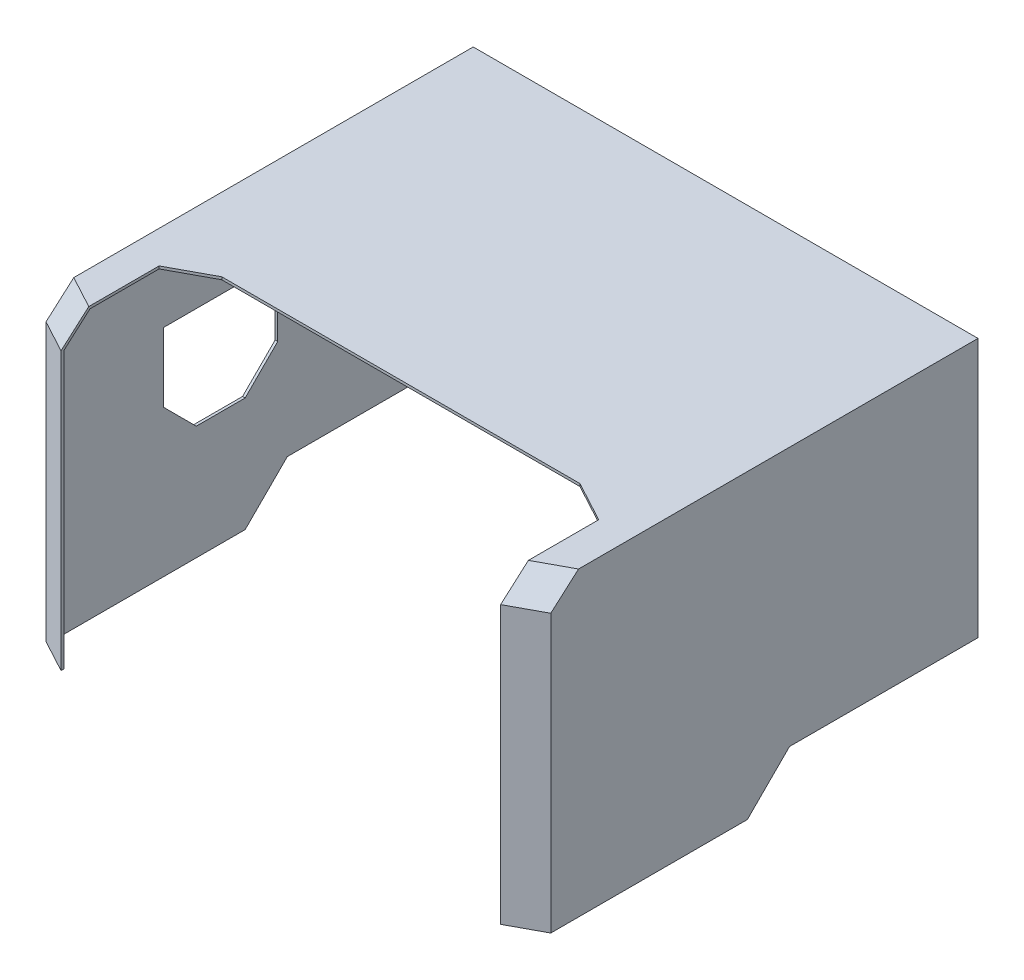
ISO-10303-21;
HEADER;
FILE_DESCRIPTION(('STEP AP214'),'2;1');
FILE_NAME('part.step','',(''),(''),'','','');
FILE_SCHEMA(('AUTOMOTIVE_DESIGN { 1 0 10303 214 1 1 1 1 }'));
ENDSEC;
DATA;
#1=APPLICATION_CONTEXT('core data for automotive mechanical design processes');
#2=APPLICATION_PROTOCOL_DEFINITION('international standard','automotive_design',2000,#1);
#3=PRODUCT_CONTEXT('',#1,'mechanical');
#4=PRODUCT('Part','Part','',(#3));
#5=PRODUCT_RELATED_PRODUCT_CATEGORY('part','',(#4));
#6=PRODUCT_DEFINITION_FORMATION('','',#4);
#7=PRODUCT_DEFINITION_CONTEXT('part definition',#1,'design');
#8=PRODUCT_DEFINITION('design','',#6,#7);
#9=PRODUCT_DEFINITION_SHAPE('','',#8);
#10=(LENGTH_UNIT() NAMED_UNIT(*) SI_UNIT(.MILLI.,.METRE.));
#11=(NAMED_UNIT(*) PLANE_ANGLE_UNIT() SI_UNIT($,.RADIAN.));
#12=(NAMED_UNIT(*) SI_UNIT($,.STERADIAN.) SOLID_ANGLE_UNIT());
#13=UNCERTAINTY_MEASURE_WITH_UNIT(LENGTH_MEASURE(1.E-05),#10,'distance_accuracy_value','');
#14=(GEOMETRIC_REPRESENTATION_CONTEXT(3) GLOBAL_UNCERTAINTY_ASSIGNED_CONTEXT((#13)) GLOBAL_UNIT_ASSIGNED_CONTEXT((#10,
#11,#12)) REPRESENTATION_CONTEXT('',''));
#15=CARTESIAN_POINT('',(0.,0.,0.));
#16=DIRECTION('',(0.,0.,1.));
#17=DIRECTION('',(1.,0.,0.));
#18=AXIS2_PLACEMENT_3D('',#15,#16,#17);
#19=CARTESIAN_POINT('',(354.056220457634,49.99,163.381713280479));
#20=DIRECTION('',(-1.,0.,0.));
#21=DIRECTION('',(0.,0.,1.));
#22=AXIS2_PLACEMENT_3D('',#19,#20,#21);
#23=PLANE('',#22);
#24=DIRECTION('',(0.,-0.660751107356154,0.750605072010319));
#25=VECTOR('',#24,1.);
#26=CARTESIAN_POINT('',(354.056220457634,374.541367845536,301.368842451599));
#27=LINE('',#26,#25);
#28=CARTESIAN_POINT('',(354.056220457634,420.,249.728399504298));
#29=VERTEX_POINT('',#28);
#30=CARTESIAN_POINT('',(354.056220457634,390.,283.808027838802));
#31=VERTEX_POINT('',#30);
#32=EDGE_CURVE('E348',#29,#31,#27,.T.);
#33=ORIENTED_EDGE('',*,*,#32,.F.);
#34=DIRECTION('',(0.,0.,1.));
#35=VECTOR('',#34,1.);
#36=CARTESIAN_POINT('',(354.056220457634,420.,0.));
#37=LINE('',#36,#35);
#38=CARTESIAN_POINT('',(354.056220457634,420.,163.381713280479));
#39=VERTEX_POINT('',#38);
#40=EDGE_CURVE('E352',#39,#29,#37,.T.);
#41=ORIENTED_EDGE('',*,*,#40,.F.);
#42=DIRECTION('',(0.,1.,0.));
#43=VECTOR('',#42,1.);
#44=CARTESIAN_POINT('',(354.056220457634,49.99,163.381713280479));
#45=LINE('',#44,#43);
#46=CARTESIAN_POINT('',(354.056220457634,416.82,163.381713280479));
#47=VERTEX_POINT('',#46);
#48=EDGE_CURVE('E11',#47,#39,#45,.T.);
#49=ORIENTED_EDGE('',*,*,#48,.F.);
#50=DIRECTION('',(0.,0.,1.));
#51=VECTOR('',#50,1.);
#52=CARTESIAN_POINT('',(354.056220457634,416.82,0.));
#53=LINE('',#52,#51);
#54=CARTESIAN_POINT('',(354.056220457634,416.82,248.232077613078));
#55=VERTEX_POINT('',#54);
#56=EDGE_CURVE('E237',#47,#55,#53,.T.);
#57=ORIENTED_EDGE('',*,*,#56,.T.);
#58=DIRECTION('',(0.,-0.660751107356154,0.750605072010319));
#59=VECTOR('',#58,1.);
#60=CARTESIAN_POINT('',(354.056220457634,372.007609995386,299.138397484348));
#61=LINE('',#60,#59);
#62=CARTESIAN_POINT('',(354.056220457634,388.682800871653,280.195587235344));
#63=VERTEX_POINT('',#62);
#64=EDGE_CURVE('E247',#55,#63,#61,.T.);
#65=ORIENTED_EDGE('',*,*,#64,.T.);
#66=DIRECTION('',(0.,1.,0.));
#67=VECTOR('',#66,1.);
#68=CARTESIAN_POINT('',(354.056220457634,1040.95052293774,280.195587235344));
#69=LINE('',#68,#67);
#70=CARTESIAN_POINT('',(354.056220457634,50.,280.195587235344));
#71=VERTEX_POINT('',#70);
#72=EDGE_CURVE('E346',#71,#63,#69,.T.);
#73=ORIENTED_EDGE('',*,*,#72,.F.);
#74=DIRECTION('',(0.,0.,1.));
#75=VECTOR('',#74,1.);
#76=CARTESIAN_POINT('',(354.056220457634,50.,20.9300000000832));
#77=LINE('',#76,#75);
#78=CARTESIAN_POINT('',(354.056220457634,50.,283.808027838802));
#79=VERTEX_POINT('',#78);
#80=EDGE_CURVE('E370',#71,#79,#77,.T.);
#81=ORIENTED_EDGE('',*,*,#80,.T.);
#82=DIRECTION('',(0.,1.,0.));
#83=VECTOR('',#82,1.);
#84=CARTESIAN_POINT('',(354.056220457634,1040.95052293774,283.808027838802));
#85=LINE('',#84,#83);
#86=EDGE_CURVE('E373',#79,#31,#85,.T.);
#87=ORIENTED_EDGE('',*,*,#86,.T.);
#88=EDGE_LOOP('',(#33,#41,#49,#57,#65,#73,#81,#87));
#89=FACE_BOUND('',#88,.T.);
#90=ADVANCED_FACE('F33',(#89),#23,.T.);
#91=CARTESIAN_POINT('',(304.056220457634,49.99,136.434178481977));
#92=DIRECTION('',(-0.474433603571065,0.,0.880291290313936));
#93=DIRECTION('',(0.880291290313936,0.,0.474433603571065));
#94=AXIS2_PLACEMENT_3D('',#91,#92,#93);
#95=PLANE('',#94);
#96=DIRECTION('',(0.,1.,0.));
#97=VECTOR('',#96,1.);
#98=CARTESIAN_POINT('',(304.056220457634,49.99,136.434178481977));
#99=LINE('',#98,#97);
#100=CARTESIAN_POINT('',(304.056220457634,416.82,136.434178481977));
#101=VERTEX_POINT('',#100);
#102=CARTESIAN_POINT('',(304.056220457634,420.,136.434178481977));
#103=VERTEX_POINT('',#102);
#104=EDGE_CURVE('E42',#101,#103,#99,.T.);
#105=ORIENTED_EDGE('',*,*,#104,.F.);
#106=DIRECTION('',(0.880291290313936,0.,0.474433603571065));
#107=VECTOR('',#106,1.);
#108=CARTESIAN_POINT('',(11.4588379513546,416.82,-21.2613844587955));
#109=LINE('',#108,#107);
#110=EDGE_CURVE('E249',#101,#47,#109,.T.);
#111=ORIENTED_EDGE('',*,*,#110,.T.);
#112=ORIENTED_EDGE('',*,*,#48,.T.);
#113=DIRECTION('',(0.880291290313936,0.,0.474433603571065));
#114=VECTOR('',#113,1.);
#115=CARTESIAN_POINT('',(11.4588379513546,420.,-21.2613844587955));
#116=LINE('',#115,#114);
#117=EDGE_CURVE('E355',#103,#39,#116,.T.);
#118=ORIENTED_EDGE('',*,*,#117,.F.);
#119=EDGE_LOOP('',(#105,#111,#112,#118));
#120=FACE_BOUND('',#119,.T.);
#121=ADVANCED_FACE('F389',(#120),#95,.T.);
#122=CARTESIAN_POINT('',(-135.65,49.99,136.434178481977));
#123=DIRECTION('',(0.,0.,1.));
#124=DIRECTION('',(1.,0.,0.));
#125=AXIS2_PLACEMENT_3D('',#122,#123,#124);
#126=PLANE('',#125);
#127=DIRECTION('',(0.,1.,0.));
#128=VECTOR('',#127,1.);
#129=CARTESIAN_POINT('',(-135.65,49.99,136.434178481977));
#130=LINE('',#129,#128);
#131=CARTESIAN_POINT('',(-135.65,416.82,136.434178481977));
#132=VERTEX_POINT('',#131);
#133=CARTESIAN_POINT('',(-135.65,420.,136.434178481977));
#134=VERTEX_POINT('',#133);
#135=EDGE_CURVE('E340',#132,#134,#130,.T.);
#136=ORIENTED_EDGE('',*,*,#135,.F.);
#137=DIRECTION('',(1.,0.,0.));
#138=VECTOR('',#137,1.);
#139=CARTESIAN_POINT('',(0.,416.82,136.434178481977));
#140=LINE('',#139,#138);
#141=EDGE_CURVE('E385',#132,#101,#140,.T.);
#142=ORIENTED_EDGE('',*,*,#141,.T.);
#143=ORIENTED_EDGE('',*,*,#104,.T.);
#144=DIRECTION('',(1.,0.,0.));
#145=VECTOR('',#144,1.);
#146=CARTESIAN_POINT('',(0.,420.,136.434178481977));
#147=LINE('',#146,#145);
#148=EDGE_CURVE('E358',#134,#103,#147,.T.);
#149=ORIENTED_EDGE('',*,*,#148,.F.);
#150=EDGE_LOOP('',(#136,#142,#143,#149));
#151=FACE_BOUND('',#150,.T.);
#152=ADVANCED_FACE('F394',(#151),#126,.T.);
#153=CARTESIAN_POINT('',(-185.65,49.99,313.732193207324));
#154=DIRECTION('',(1.,0.,0.));
#155=DIRECTION('',(0.,0.,-1.));
#156=AXIS2_PLACEMENT_3D('',#153,#154,#155);
#157=PLANE('',#156);
#158=DIRECTION('',(0.,0.660751107356154,-0.750605072010319));
#159=VECTOR('',#158,1.);
#160=CARTESIAN_POINT('',(-185.65,409.424009809615,261.742593336221));
#161=LINE('',#160,#159);
#162=CARTESIAN_POINT('',(-185.65,390.,283.808027838802));
#163=VERTEX_POINT('',#162);
#164=CARTESIAN_POINT('',(-185.65,420.,249.728399504298));
#165=VERTEX_POINT('',#164);
#166=EDGE_CURVE('E350',#163,#165,#161,.T.);
#167=ORIENTED_EDGE('',*,*,#166,.F.);
#168=DIRECTION('',(0.,-1.,0.));
#169=VECTOR('',#168,1.);
#170=CARTESIAN_POINT('',(-185.65,1040.95052293774,283.808027838802));
#171=LINE('',#170,#169);
#172=CARTESIAN_POINT('',(-185.65,50.,283.808027838802));
#173=VERTEX_POINT('',#172);
#174=EDGE_CURVE('E376',#163,#173,#171,.T.);
#175=ORIENTED_EDGE('',*,*,#174,.T.);
#176=DIRECTION('',(0.,0.,-1.));
#177=VECTOR('',#176,1.);
#178=CARTESIAN_POINT('',(-185.65,50.,20.9300000000832));
#179=LINE('',#178,#177);
#180=CARTESIAN_POINT('',(-185.65,50.,280.195587235344));
#181=VERTEX_POINT('',#180);
#182=EDGE_CURVE('E367',#173,#181,#179,.T.);
#183=ORIENTED_EDGE('',*,*,#182,.T.);
#184=DIRECTION('',(0.,-1.,0.));
#185=VECTOR('',#184,1.);
#186=CARTESIAN_POINT('',(-185.65,1040.95052293774,280.195587235344));
#187=LINE('',#186,#185);
#188=CARTESIAN_POINT('',(-185.65,388.682800871653,280.195587235344));
#189=VERTEX_POINT('',#188);
#190=EDGE_CURVE('E343',#189,#181,#187,.T.);
#191=ORIENTED_EDGE('',*,*,#190,.F.);
#192=DIRECTION('',(0.,0.660751107356154,-0.750605072010319));
#193=VECTOR('',#192,1.);
#194=CARTESIAN_POINT('',(-185.65,406.890251959465,259.512148368969));
#195=LINE('',#194,#193);
#196=CARTESIAN_POINT('',(-185.65,416.82,248.232077613078));
#197=VERTEX_POINT('',#196);
#198=EDGE_CURVE('E250',#189,#197,#195,.T.);
#199=ORIENTED_EDGE('',*,*,#198,.T.);
#200=DIRECTION('',(0.,0.,-1.));
#201=VECTOR('',#200,1.);
#202=CARTESIAN_POINT('',(-185.65,416.82,0.));
#203=LINE('',#202,#201);
#204=CARTESIAN_POINT('',(-185.65,416.82,163.381713280479));
#205=VERTEX_POINT('',#204);
#206=EDGE_CURVE('E379',#197,#205,#203,.T.);
#207=ORIENTED_EDGE('',*,*,#206,.T.);
#208=DIRECTION('',(0.,1.,0.));
#209=VECTOR('',#208,1.);
#210=CARTESIAN_POINT('',(-185.65,49.99,163.381713280479));
#211=LINE('',#210,#209);
#212=CARTESIAN_POINT('',(-185.65,420.,163.381713280479));
#213=VERTEX_POINT('',#212);
#214=EDGE_CURVE('E337',#205,#213,#211,.T.);
#215=ORIENTED_EDGE('',*,*,#214,.T.);
#216=DIRECTION('',(0.,0.,-1.));
#217=VECTOR('',#216,1.);
#218=CARTESIAN_POINT('',(-185.65,420.,0.));
#219=LINE('',#218,#217);
#220=EDGE_CURVE('E364',#165,#213,#219,.T.);
#221=ORIENTED_EDGE('',*,*,#220,.F.);
#222=EDGE_LOOP('',(#167,#175,#183,#191,#199,#207,#215,#221));
#223=FACE_BOUND('',#222,.T.);
#224=ADVANCED_FACE('F401',(#223),#157,.T.);
#225=CARTESIAN_POINT('',(-185.65,49.99,163.381713280479));
#226=DIRECTION('',(0.474433603571064,0.,0.880291290313936));
#227=DIRECTION('',(0.880291290313936,0.,-0.474433603571064));
#228=AXIS2_PLACEMENT_3D('',#225,#226,#227);
#229=PLANE('',#228);
#230=ORIENTED_EDGE('',*,*,#214,.F.);
#231=DIRECTION('',(0.880291290313936,0.,-0.474433603571064));
#232=VECTOR('',#231,1.);
#233=CARTESIAN_POINT('',(26.4472541171585,416.82,49.0717505607015));
#234=LINE('',#233,#232);
#235=EDGE_CURVE('E382',#205,#132,#234,.T.);
#236=ORIENTED_EDGE('',*,*,#235,.T.);
#237=ORIENTED_EDGE('',*,*,#135,.T.);
#238=DIRECTION('',(0.880291290313936,0.,-0.474433603571064));
#239=VECTOR('',#238,1.);
#240=CARTESIAN_POINT('',(26.4472541171585,420.,49.0717505607015));
#241=LINE('',#240,#239);
#242=EDGE_CURVE('E361',#213,#134,#241,.T.);
#243=ORIENTED_EDGE('',*,*,#242,.F.);
#244=EDGE_LOOP('',(#230,#236,#237,#243));
#245=FACE_BOUND('',#244,.T.);
#246=ADVANCED_FACE('F398',(#245),#229,.T.);
#247=CARTESIAN_POINT('',(394.066220457634,50.,20.9300000000832));
#248=DIRECTION('',(0.,1.,0.));
#249=DIRECTION('',(0.,0.,1.));
#250=AXIS2_PLACEMENT_3D('',#247,#248,#249);
#251=PLANE('',#250);
#252=ORIENTED_EDGE('',*,*,#182,.F.);
#253=DIRECTION('',(0.880291290313936,0.,0.474433603571064));
#254=VECTOR('',#253,1.);
#255=CARTESIAN_POINT('',(-225.65,50.,262.25));
#256=LINE('',#255,#254);
#257=CARTESIAN_POINT('',(-225.65,50.,262.25));
#258=VERTEX_POINT('',#257);
#259=EDGE_CURVE('E269',#258,#173,#256,.T.);
#260=ORIENTED_EDGE('',*,*,#259,.F.);
#261=DIRECTION('',(0.,0.,1.));
#262=VECTOR('',#261,1.);
#263=CARTESIAN_POINT('',(-225.65,50.,-262.25));
#264=LINE('',#263,#262);
#265=CARTESIAN_POINT('',(-225.65,50.,20.9300000000832));
#266=VERTEX_POINT('',#265);
#267=EDGE_CURVE('E505',#266,#258,#264,.T.);
#268=ORIENTED_EDGE('',*,*,#267,.F.);
#269=DIRECTION('',(-1.,0.,0.));
#270=VECTOR('',#269,1.);
#271=CARTESIAN_POINT('',(394.066220457634,50.,20.9300000000832));
#272=LINE('',#271,#270);
#273=CARTESIAN_POINT('',(-222.47,50.,20.9300000000832));
#274=VERTEX_POINT('',#273);
#275=EDGE_CURVE('E497',#274,#266,#272,.T.);
#276=ORIENTED_EDGE('',*,*,#275,.F.);
#277=DIRECTION('',(0.,0.,1.));
#278=VECTOR('',#277,1.);
#279=CARTESIAN_POINT('',(-222.47,50.,-262.25));
#280=LINE('',#279,#278);
#281=CARTESIAN_POINT('',(-222.47,50.,260.351422609727));
#282=VERTEX_POINT('',#281);
#283=EDGE_CURVE('E599',#274,#282,#280,.T.);
#284=ORIENTED_EDGE('',*,*,#283,.T.);
#285=DIRECTION('',(0.880291290313936,0.,0.474433603571064));
#286=VECTOR('',#285,1.);
#287=CARTESIAN_POINT('',(-224.141301140644,50.,259.450673696802));
#288=LINE('',#287,#286);
#289=EDGE_CURVE('E260',#282,#181,#288,.T.);
#290=ORIENTED_EDGE('',*,*,#289,.T.);
#291=EDGE_LOOP('',(#252,#260,#268,#276,#284,#290));
#292=FACE_BOUND('',#291,.T.);
#293=ADVANCED_FACE('F558',(#292),#251,.F.);
#294=ORIENTED_EDGE('',*,*,#80,.F.);
#295=DIRECTION('',(0.880291290313937,0.,-0.474433603571063));
#296=VECTOR('',#295,1.);
#297=CARTESIAN_POINT('',(319.645467286542,50.,298.741286605758));
#298=LINE('',#297,#296);
#299=CARTESIAN_POINT('',(390.876220457634,50.,260.351422609727));
#300=VERTEX_POINT('',#299);
#301=EDGE_CURVE('E263',#71,#300,#298,.T.);
#302=ORIENTED_EDGE('',*,*,#301,.T.);
#303=DIRECTION('',(0.,0.,-1.));
#304=VECTOR('',#303,1.);
#305=CARTESIAN_POINT('',(390.876220457634,50.,262.25));
#306=LINE('',#305,#304);
#307=CARTESIAN_POINT('',(390.876220457634,50.,20.9300000000832));
#308=VERTEX_POINT('',#307);
#309=EDGE_CURVE('E422',#300,#308,#306,.T.);
#310=ORIENTED_EDGE('',*,*,#309,.T.);
#311=CARTESIAN_POINT('',(394.056220457634,50.,20.9300000000832));
#312=VERTEX_POINT('',#311);
#313=EDGE_CURVE('E264',#312,#308,#272,.T.);
#314=ORIENTED_EDGE('',*,*,#313,.F.);
#315=DIRECTION('',(0.,0.,-1.));
#316=VECTOR('',#315,1.);
#317=CARTESIAN_POINT('',(394.056220457634,50.,262.25));
#318=LINE('',#317,#316);
#319=CARTESIAN_POINT('',(394.056220457634,50.,262.25));
#320=VERTEX_POINT('',#319);
#321=EDGE_CURVE('E432',#320,#312,#318,.T.);
#322=ORIENTED_EDGE('',*,*,#321,.F.);
#323=DIRECTION('',(0.880291290313937,0.,-0.474433603571063));
#324=VECTOR('',#323,1.);
#325=CARTESIAN_POINT('',(321.154166145898,50.,301.540612908956));
#326=LINE('',#325,#324);
#327=EDGE_CURVE('E267',#79,#320,#326,.T.);
#328=ORIENTED_EDGE('',*,*,#327,.F.);
#329=EDGE_LOOP('',(#294,#302,#310,#314,#322,#328));
#330=FACE_BOUND('',#329,.T.);
#331=ADVANCED_FACE('F429',(#330),#251,.F.);
#332=CARTESIAN_POINT('',(0.,420.,0.));
#333=DIRECTION('',(0.,1.,0.));
#334=DIRECTION('',(0.,0.,1.));
#335=AXIS2_PLACEMENT_3D('',#332,#333,#334);
#336=PLANE('',#335);
#337=DIRECTION('',(0.880291290313936,0.,0.474433603571064));
#338=VECTOR('',#337,1.);
#339=CARTESIAN_POINT('',(-138.514937581133,420.,275.131874199538));
#340=LINE('',#339,#338);
#341=CARTESIAN_POINT('',(-225.65,420.,228.170371665496));
#342=VERTEX_POINT('',#341);
#343=EDGE_CURVE('E282',#342,#165,#340,.T.);
#344=ORIENTED_EDGE('',*,*,#343,.T.);
#345=ORIENTED_EDGE('',*,*,#220,.T.);
#346=ORIENTED_EDGE('',*,*,#242,.T.);
#347=ORIENTED_EDGE('',*,*,#148,.T.);
#348=ORIENTED_EDGE('',*,*,#117,.T.);
#349=ORIENTED_EDGE('',*,*,#40,.T.);
#350=DIRECTION('',(0.880291290313937,0.,-0.474433603571063));
#351=VECTOR('',#350,1.);
#352=CARTESIAN_POINT('',(379.823212350502,420.,235.841261290582));
#353=LINE('',#352,#351);
#354=CARTESIAN_POINT('',(394.056220457634,420.,228.170371665496));
#355=VERTEX_POINT('',#354);
#356=EDGE_CURVE('E280',#29,#355,#353,.T.);
#357=ORIENTED_EDGE('',*,*,#356,.T.);
#358=DIRECTION('',(0.,0.,-1.));
#359=VECTOR('',#358,1.);
#360=CARTESIAN_POINT('',(394.056220457634,420.,262.25));
#361=LINE('',#360,#359);
#362=CARTESIAN_POINT('',(394.056220457634,420.,-262.25));
#363=VERTEX_POINT('',#362);
#364=EDGE_CURVE('E449',#355,#363,#361,.T.);
#365=ORIENTED_EDGE('',*,*,#364,.T.);
#366=DIRECTION('',(-1.,0.,0.));
#367=VECTOR('',#366,1.);
#368=CARTESIAN_POINT('',(394.056220457634,420.,-262.25));
#369=LINE('',#368,#367);
#370=CARTESIAN_POINT('',(-225.65,420.,-262.25));
#371=VERTEX_POINT('',#370);
#372=EDGE_CURVE('E310',#363,#371,#369,.T.);
#373=ORIENTED_EDGE('',*,*,#372,.T.);
#374=DIRECTION('',(0.,0.,1.));
#375=VECTOR('',#374,1.);
#376=CARTESIAN_POINT('',(-225.65,420.,-262.25));
#377=LINE('',#376,#375);
#378=EDGE_CURVE('E455',#371,#342,#377,.T.);
#379=ORIENTED_EDGE('',*,*,#378,.T.);
#380=EDGE_LOOP('',(#344,#345,#346,#347,#348,#349,#357,#365,#373,#379));
#381=FACE_BOUND('',#380,.T.);
#382=ADVANCED_FACE('F442',(#381),#336,.T.);
#383=CARTESIAN_POINT('',(321.154166145898,1040.95052293774,301.540612908956));
#384=DIRECTION('',(-0.474433603571063,0.,-0.880291290313936));
#385=DIRECTION('',(-0.880291290313937,0.,0.474433603571063));
#386=AXIS2_PLACEMENT_3D('',#383,#384,#385);
#387=PLANE('',#386);
#388=ORIENTED_EDGE('',*,*,#86,.F.);
#389=ORIENTED_EDGE('',*,*,#327,.T.);
#390=DIRECTION('',(0.,-1.,0.));
#391=VECTOR('',#390,1.);
#392=CARTESIAN_POINT('',(394.056220457634,370.,262.25));
#393=LINE('',#392,#391);
#394=CARTESIAN_POINT('',(394.056220457634,390.,262.25));
#395=VERTEX_POINT('',#394);
#396=EDGE_CURVE('E437',#395,#320,#393,.T.);
#397=ORIENTED_EDGE('',*,*,#396,.F.);
#398=DIRECTION('',(-0.880291290313937,0.,0.474433603571063));
#399=VECTOR('',#398,1.);
#400=CARTESIAN_POINT('',(321.154166145898,390.,301.540612908956));
#401=LINE('',#400,#399);
#402=EDGE_CURVE('E275',#395,#31,#401,.T.);
#403=ORIENTED_EDGE('',*,*,#402,.T.);
#404=EDGE_LOOP('',(#388,#389,#397,#403));
#405=FACE_BOUND('',#404,.T.);
#406=ADVANCED_FACE('F436',(#405),#387,.F.);
#407=CARTESIAN_POINT('',(-225.65,1040.95052293774,262.25));
#408=DIRECTION('',(0.474433603571064,0.,-0.880291290313936));
#409=DIRECTION('',(-0.880291290313936,0.,-0.474433603571064));
#410=AXIS2_PLACEMENT_3D('',#407,#408,#409);
#411=PLANE('',#410);
#412=ORIENTED_EDGE('',*,*,#174,.F.);
#413=DIRECTION('',(-0.880291290313936,0.,-0.474433603571064));
#414=VECTOR('',#413,1.);
#415=CARTESIAN_POINT('',(-225.65,390.,262.25));
#416=LINE('',#415,#414);
#417=CARTESIAN_POINT('',(-225.65,390.,262.25));
#418=VERTEX_POINT('',#417);
#419=EDGE_CURVE('E273',#163,#418,#416,.T.);
#420=ORIENTED_EDGE('',*,*,#419,.T.);
#421=DIRECTION('',(0.,-1.,0.));
#422=VECTOR('',#421,1.);
#423=CARTESIAN_POINT('',(-225.65,370.,262.25));
#424=LINE('',#423,#422);
#425=EDGE_CURVE('E285',#418,#258,#424,.T.);
#426=ORIENTED_EDGE('',*,*,#425,.T.);
#427=ORIENTED_EDGE('',*,*,#259,.T.);
#428=EDGE_LOOP('',(#412,#420,#426,#427));
#429=FACE_BOUND('',#428,.T.);
#430=ADVANCED_FACE('F586',(#429),#411,.F.);
#431=CARTESIAN_POINT('',(-146.083957980917,420.,271.052545387263));
#432=DIRECTION('',(-0.335475218307871,0.707106781186544,0.622459940800443));
#433=DIRECTION('',(-0.880291290313936,0.,-0.474433603571064));
#434=AXIS2_PLACEMENT_3D('',#431,#432,#433);
#435=PLANE('',#434);
#436=ORIENTED_EDGE('',*,*,#419,.F.);
#437=ORIENTED_EDGE('',*,*,#166,.T.);
#438=ORIENTED_EDGE('',*,*,#343,.F.);
#439=DIRECTION('',(0.,0.660751107356154,-0.750605072010319));
#440=VECTOR('',#439,1.);
#441=CARTESIAN_POINT('',(-225.65,398.732022791773,252.330530288265));
#442=LINE('',#441,#440);
#443=EDGE_CURVE('E276',#418,#342,#442,.T.);
#444=ORIENTED_EDGE('',*,*,#443,.F.);
#445=EDGE_LOOP('',(#436,#437,#438,#444));
#446=FACE_BOUND('',#445,.T.);
#447=ADVANCED_FACE('F35',(#446),#435,.T.);
#448=CARTESIAN_POINT('',(183.990050049429,420.,341.385680406759));
#449=DIRECTION('',(0.33547521830787,0.707106781186544,0.622459940800443));
#450=DIRECTION('',(-0.880291290313937,0.,0.474433603571063));
#451=AXIS2_PLACEMENT_3D('',#448,#449,#450);
#452=PLANE('',#451);
#453=ORIENTED_EDGE('',*,*,#356,.F.);
#454=ORIENTED_EDGE('',*,*,#32,.T.);
#455=ORIENTED_EDGE('',*,*,#402,.F.);
#456=DIRECTION('',(0.,-0.660751107356154,0.750605072010319));
#457=VECTOR('',#456,1.);
#458=CARTESIAN_POINT('',(394.056220457634,363.849380827695,291.956779403644));
#459=LINE('',#458,#457);
#460=EDGE_CURVE('E279',#355,#395,#459,.T.);
#461=ORIENTED_EDGE('',*,*,#460,.F.);
#462=EDGE_LOOP('',(#453,#454,#455,#461));
#463=FACE_BOUND('',#462,.T.);
#464=ADVANCED_FACE('F444',(#463),#452,.T.);
#465=CARTESIAN_POINT('',(0.,416.82,0.));
#466=DIRECTION('',(0.,1.,0.));
#467=DIRECTION('',(0.,0.,1.));
#468=AXIS2_PLACEMENT_3D('',#465,#466,#467);
#469=PLANE('',#468);
#470=ORIENTED_EDGE('',*,*,#206,.F.);
#471=DIRECTION('',(0.880291290313936,0.,0.474433603571064));
#472=VECTOR('',#471,1.);
#473=CARTESIAN_POINT('',(-145.459034451835,416.82,269.89302646697));
#474=LINE('',#473,#472);
#475=CARTESIAN_POINT('',(-222.47,416.82,228.387912987461));
#476=VERTEX_POINT('',#475);
#477=EDGE_CURVE('E37',#476,#197,#474,.T.);
#478=ORIENTED_EDGE('',*,*,#477,.F.);
#479=DIRECTION('',(0.,0.,1.));
#480=VECTOR('',#479,1.);
#481=CARTESIAN_POINT('',(-222.47,416.82,-262.25));
#482=LINE('',#481,#480);
#483=CARTESIAN_POINT('',(-222.47,416.82,-259.07));
#484=VERTEX_POINT('',#483);
#485=EDGE_CURVE('E296',#484,#476,#482,.T.);
#486=ORIENTED_EDGE('',*,*,#485,.F.);
#487=DIRECTION('',(-1.,0.,0.));
#488=VECTOR('',#487,1.);
#489=CARTESIAN_POINT('',(0.,416.82,-259.07));
#490=LINE('',#489,#488);
#491=CARTESIAN_POINT('',(390.876220457634,416.82,-259.07));
#492=VERTEX_POINT('',#491);
#493=EDGE_CURVE('E301',#492,#484,#490,.T.);
#494=ORIENTED_EDGE('',*,*,#493,.F.);
#495=DIRECTION('',(0.,0.,-1.));
#496=VECTOR('',#495,1.);
#497=CARTESIAN_POINT('',(390.876220457634,416.82,262.25));
#498=LINE('',#497,#496);
#499=CARTESIAN_POINT('',(390.876220457634,416.82,228.387912987461));
#500=VERTEX_POINT('',#499);
#501=EDGE_CURVE('E240',#500,#492,#498,.T.);
#502=ORIENTED_EDGE('',*,*,#501,.F.);
#503=DIRECTION('',(0.880291290313936,0.,-0.474433603571063));
#504=VECTOR('',#503,1.);
#505=CARTESIAN_POINT('',(183.365126520347,416.82,340.226161486467));
#506=LINE('',#505,#504);
#507=EDGE_CURVE('E232',#55,#500,#506,.T.);
#508=ORIENTED_EDGE('',*,*,#507,.F.);
#509=ORIENTED_EDGE('',*,*,#56,.F.);
#510=ORIENTED_EDGE('',*,*,#110,.F.);
#511=ORIENTED_EDGE('',*,*,#141,.F.);
#512=ORIENTED_EDGE('',*,*,#235,.F.);
#513=EDGE_LOOP('',(#470,#478,#486,#494,#502,#508,#509,#510,#511,#512));
#514=FACE_BOUND('',#513,.T.);
#515=ADVANCED_FACE('F235',(#514),#469,.F.);
#516=CARTESIAN_POINT('',(319.645467286542,1040.95052293774,298.741286605758));
#517=DIRECTION('',(-0.474433603571063,0.,-0.880291290313936));
#518=DIRECTION('',(-0.880291290313937,0.,0.474433603571063));
#519=AXIS2_PLACEMENT_3D('',#516,#517,#518);
#520=PLANE('',#519);
#521=ORIENTED_EDGE('',*,*,#301,.F.);
#522=ORIENTED_EDGE('',*,*,#72,.T.);
#523=DIRECTION('',(-0.880291290313936,0.,0.474433603571063));
#524=VECTOR('',#523,1.);
#525=CARTESIAN_POINT('',(196.714359297205,388.682800871653,364.995092812979));
#526=LINE('',#525,#524);
#527=CARTESIAN_POINT('',(390.876220457634,388.682800871653,260.351422609727));
#528=VERTEX_POINT('',#527);
#529=EDGE_CURVE('E254',#528,#63,#526,.T.);
#530=ORIENTED_EDGE('',*,*,#529,.F.);
#531=DIRECTION('',(0.,-1.,0.));
#532=VECTOR('',#531,1.);
#533=CARTESIAN_POINT('',(390.876220457634,370.,260.351422609727));
#534=LINE('',#533,#532);
#535=EDGE_CURVE('E293',#528,#300,#534,.T.);
#536=ORIENTED_EDGE('',*,*,#535,.T.);
#537=EDGE_LOOP('',(#521,#522,#530,#536));
#538=FACE_BOUND('',#537,.T.);
#539=ADVANCED_FACE('F425',(#538),#520,.T.);
#540=CARTESIAN_POINT('',(-224.141301140644,1040.95052293774,259.450673696802));
#541=DIRECTION('',(0.474433603571064,0.,-0.880291290313936));
#542=DIRECTION('',(-0.880291290313936,0.,-0.474433603571064));
#543=AXIS2_PLACEMENT_3D('',#540,#541,#542);
#544=PLANE('',#543);
#545=DIRECTION('',(-0.880291290313936,0.,-0.474433603571064));
#546=VECTOR('',#545,1.);
#547=CARTESIAN_POINT('',(-158.808267228693,388.682800871653,294.661957793482));
#548=LINE('',#547,#546);
#549=CARTESIAN_POINT('',(-222.47,388.682800871653,260.351422609727));
#550=VERTEX_POINT('',#549);
#551=EDGE_CURVE('E286',#189,#550,#548,.T.);
#552=ORIENTED_EDGE('',*,*,#551,.F.);
#553=ORIENTED_EDGE('',*,*,#190,.T.);
#554=ORIENTED_EDGE('',*,*,#289,.F.);
#555=DIRECTION('',(0.,-1.,0.));
#556=VECTOR('',#555,1.);
#557=CARTESIAN_POINT('',(-222.47,1040.95052293774,260.351422609727));
#558=LINE('',#557,#556);
#559=EDGE_CURVE('E311',#550,#282,#558,.T.);
#560=ORIENTED_EDGE('',*,*,#559,.F.);
#561=EDGE_LOOP('',(#552,#553,#554,#560));
#562=FACE_BOUND('',#561,.T.);
#563=ADVANCED_FACE('F573',(#562),#544,.T.);
#564=CARTESIAN_POINT('',(-145.017146786698,417.751400435827,269.073122775517));
#565=DIRECTION('',(-0.335475218307871,0.707106781186544,0.622459940800443));
#566=DIRECTION('',(-0.880291290313936,0.,-0.474433603571064));
#567=AXIS2_PLACEMENT_3D('',#564,#565,#566);
#568=PLANE('',#567);
#569=ORIENTED_EDGE('',*,*,#198,.F.);
#570=ORIENTED_EDGE('',*,*,#551,.T.);
#571=DIRECTION('',(0.,0.660751107356154,-0.750605072010319));
#572=VECTOR('',#571,1.);
#573=CARTESIAN_POINT('',(-222.47,397.048277909541,250.848344333326));
#574=LINE('',#573,#572);
#575=EDGE_CURVE('E288',#550,#476,#574,.T.);
#576=ORIENTED_EDGE('',*,*,#575,.T.);
#577=ORIENTED_EDGE('',*,*,#477,.T.);
#578=EDGE_LOOP('',(#569,#570,#576,#577));
#579=FACE_BOUND('',#578,.T.);
#580=ADVANCED_FACE('F406',(#579),#568,.F.);
#581=CARTESIAN_POINT('',(182.92323885521,417.751400435827,339.406257795014));
#582=DIRECTION('',(0.33547521830787,0.707106781186544,0.622459940800443));
#583=DIRECTION('',(-0.880291290313937,0.,0.474433603571063));
#584=AXIS2_PLACEMENT_3D('',#581,#582,#583);
#585=PLANE('',#584);
#586=ORIENTED_EDGE('',*,*,#64,.F.);
#587=ORIENTED_EDGE('',*,*,#507,.T.);
#588=DIRECTION('',(0.,-0.660751107356154,0.750605072010319));
#589=VECTOR('',#588,1.);
#590=CARTESIAN_POINT('',(390.876220457634,362.165635945463,290.474593448704));
#591=LINE('',#590,#589);
#592=EDGE_CURVE('E244',#500,#528,#591,.T.);
#593=ORIENTED_EDGE('',*,*,#592,.T.);
#594=ORIENTED_EDGE('',*,*,#529,.T.);
#595=EDGE_LOOP('',(#586,#587,#593,#594));
#596=FACE_BOUND('',#595,.T.);
#597=ADVANCED_FACE('F252',(#596),#585,.F.);
#598=CARTESIAN_POINT('',(394.066220457634,101.747816509296,-30.8178165092128));
#599=DIRECTION('',(0.,1.,0.));
#600=DIRECTION('',(0.,0.,1.));
#601=AXIS2_PLACEMENT_3D('',#598,#599,#600);
#602=PLANE('',#601);
#603=DIRECTION('',(-1.,0.,0.));
#604=VECTOR('',#603,1.);
#605=CARTESIAN_POINT('',(394.066220457634,101.747816509296,-30.8178165092128));
#606=LINE('',#605,#604);
#607=CARTESIAN_POINT('',(394.056220457634,101.747816509296,-30.8178165092127));
#608=VERTEX_POINT('',#607);
#609=CARTESIAN_POINT('',(390.876220457634,101.747816509296,-30.8178165092127));
#610=VERTEX_POINT('',#609);
#611=EDGE_CURVE('E495',#608,#610,#606,.T.);
#612=ORIENTED_EDGE('',*,*,#611,.T.);
#613=DIRECTION('',(0.,0.,-1.));
#614=VECTOR('',#613,1.);
#615=CARTESIAN_POINT('',(390.876220457634,101.747816509296,262.25));
#616=LINE('',#615,#614);
#617=CARTESIAN_POINT('',(390.876220457634,101.747816509296,-259.07));
#618=VERTEX_POINT('',#617);
#619=EDGE_CURVE('E266',#610,#618,#616,.T.);
#620=ORIENTED_EDGE('',*,*,#619,.T.);
#621=DIRECTION('',(1.,0.,0.));
#622=VECTOR('',#621,1.);
#623=CARTESIAN_POINT('',(-225.65,101.747816509296,-259.07));
#624=LINE('',#623,#622);
#625=CARTESIAN_POINT('',(-222.47,101.747816509296,-259.07));
#626=VERTEX_POINT('',#625);
#627=EDGE_CURVE('E272',#626,#618,#624,.T.);
#628=ORIENTED_EDGE('',*,*,#627,.F.);
#629=DIRECTION('',(0.,0.,1.));
#630=VECTOR('',#629,1.);
#631=CARTESIAN_POINT('',(-222.47,101.747816509296,-262.25));
#632=LINE('',#631,#630);
#633=CARTESIAN_POINT('',(-222.47,101.747816509296,-30.8178165092128));
#634=VERTEX_POINT('',#633);
#635=EDGE_CURVE('E844',#626,#634,#632,.T.);
#636=ORIENTED_EDGE('',*,*,#635,.T.);
#637=CARTESIAN_POINT('',(-225.65,101.747816509296,-30.8178165092128));
#638=VERTEX_POINT('',#637);
#639=EDGE_CURVE('E345',#634,#638,#606,.T.);
#640=ORIENTED_EDGE('',*,*,#639,.T.);
#641=DIRECTION('',(0.,0.,1.));
#642=VECTOR('',#641,1.);
#643=CARTESIAN_POINT('',(-225.65,101.747816509296,-262.25));
#644=LINE('',#643,#642);
#645=CARTESIAN_POINT('',(-225.65,101.747816509296,-262.25));
#646=VERTEX_POINT('',#645);
#647=EDGE_CURVE('E489',#646,#638,#644,.T.);
#648=ORIENTED_EDGE('',*,*,#647,.F.);
#649=DIRECTION('',(1.,0.,0.));
#650=VECTOR('',#649,1.);
#651=CARTESIAN_POINT('',(-225.65,101.747816509296,-262.25));
#652=LINE('',#651,#650);
#653=CARTESIAN_POINT('',(394.056220457634,101.747816509296,-262.25));
#654=VERTEX_POINT('',#653);
#655=EDGE_CURVE('E468',#646,#654,#652,.T.);
#656=ORIENTED_EDGE('',*,*,#655,.T.);
#657=DIRECTION('',(0.,0.,-1.));
#658=VECTOR('',#657,1.);
#659=CARTESIAN_POINT('',(394.056220457634,101.747816509296,262.25));
#660=LINE('',#659,#658);
#661=EDGE_CURVE('E270',#608,#654,#660,.T.);
#662=ORIENTED_EDGE('',*,*,#661,.F.);
#663=EDGE_LOOP('',(#612,#620,#628,#636,#640,#648,#656,#662));
#664=FACE_BOUND('',#663,.T.);
#665=ADVANCED_FACE('F578',(#664),#602,.F.);
#666=CARTESIAN_POINT('',(394.066220457634,101.747816509296,-30.8178165092128));
#667=DIRECTION('',(0.,0.707106781186548,0.707106781186548));
#668=DIRECTION('',(0.,-0.707106781186548,0.707106781186548));
#669=AXIS2_PLACEMENT_3D('',#666,#667,#668);
#670=PLANE('',#669);
#671=DIRECTION('',(0.,-0.707106781186548,0.707106781186548));
#672=VECTOR('',#671,1.);
#673=CARTESIAN_POINT('',(-222.47,351.590000000042,-280.659999999958));
#674=LINE('',#673,#672);
#675=EDGE_CURVE('E842',#634,#274,#674,.T.);
#676=ORIENTED_EDGE('',*,*,#675,.T.);
#677=ORIENTED_EDGE('',*,*,#275,.T.);
#678=DIRECTION('',(0.,-0.707106781186548,0.707106781186548));
#679=VECTOR('',#678,1.);
#680=CARTESIAN_POINT('',(-225.65,351.590000000042,-280.659999999958));
#681=LINE('',#680,#679);
#682=EDGE_CURVE('E507',#638,#266,#681,.T.);
#683=ORIENTED_EDGE('',*,*,#682,.F.);
#684=ORIENTED_EDGE('',*,*,#639,.F.);
#685=EDGE_LOOP('',(#676,#677,#683,#684));
#686=FACE_BOUND('',#685,.T.);
#687=ADVANCED_FACE('F740',(#686),#670,.F.);
#688=ORIENTED_EDGE('',*,*,#313,.T.);
#689=DIRECTION('',(0.,0.707106781186548,-0.707106781186548));
#690=VECTOR('',#689,1.);
#691=CARTESIAN_POINT('',(390.876220457634,89.3400000000416,-18.4099999999583));
#692=LINE('',#691,#690);
#693=EDGE_CURVE('E510',#308,#610,#692,.T.);
#694=ORIENTED_EDGE('',*,*,#693,.T.);
#695=ORIENTED_EDGE('',*,*,#611,.F.);
#696=DIRECTION('',(0.,0.707106781186548,-0.707106781186548));
#697=VECTOR('',#696,1.);
#698=CARTESIAN_POINT('',(394.056220457634,89.3400000000416,-18.4099999999583));
#699=LINE('',#698,#697);
#700=EDGE_CURVE('E487',#312,#608,#699,.T.);
#701=ORIENTED_EDGE('',*,*,#700,.F.);
#702=EDGE_LOOP('',(#688,#694,#695,#701));
#703=FACE_BOUND('',#702,.T.);
#704=ADVANCED_FACE('F493',(#703),#670,.F.);
#705=CARTESIAN_POINT('',(-225.65,370.,-262.25));
#706=DIRECTION('',(1.,0.,0.));
#707=DIRECTION('',(0.,0.,-1.));
#708=AXIS2_PLACEMENT_3D('',#705,#706,#707);
#709=PLANE('',#708);
#710=DIRECTION('',(0.,-1.,0.));
#711=VECTOR('',#710,1.);
#712=CARTESIAN_POINT('',(-225.65,315.,-19.0699999999168));
#713=LINE('',#712,#711);
#714=CARTESIAN_POINT('',(-225.65,315.,-19.0699999999168));
#715=VERTEX_POINT('',#714);
#716=CARTESIAN_POINT('',(-225.65,230.,-19.0699999999168));
#717=VERTEX_POINT('',#716);
#718=EDGE_CURVE('E334',#715,#717,#713,.T.);
#719=ORIENTED_EDGE('',*,*,#718,.F.);
#720=DIRECTION('',(0.,0.,-1.));
#721=VECTOR('',#720,1.);
#722=CARTESIAN_POINT('',(-225.65,315.,120.930000000083));
#723=LINE('',#722,#721);
#724=CARTESIAN_POINT('',(-225.65,315.,120.930000000083));
#725=VERTEX_POINT('',#724);
#726=EDGE_CURVE('E336',#725,#715,#723,.T.);
#727=ORIENTED_EDGE('',*,*,#726,.F.);
#728=DIRECTION('',(0.,1.,0.));
#729=VECTOR('',#728,1.);
#730=CARTESIAN_POINT('',(-225.65,230.,120.930000000083));
#731=LINE('',#730,#729);
#732=CARTESIAN_POINT('',(-225.65,230.,120.930000000083));
#733=VERTEX_POINT('',#732);
#734=EDGE_CURVE('E317',#733,#725,#731,.T.);
#735=ORIENTED_EDGE('',*,*,#734,.F.);
#736=DIRECTION('',(0.,0.707106781186548,0.707106781186547));
#737=VECTOR('',#736,1.);
#738=CARTESIAN_POINT('',(-225.65,190.,80.9300000000832));
#739=LINE('',#738,#737);
#740=CARTESIAN_POINT('',(-225.65,190.,80.9300000000832));
#741=VERTEX_POINT('',#740);
#742=EDGE_CURVE('E327',#741,#733,#739,.T.);
#743=ORIENTED_EDGE('',*,*,#742,.F.);
#744=DIRECTION('',(0.,0.,1.));
#745=VECTOR('',#744,1.);
#746=CARTESIAN_POINT('',(-225.65,190.,20.9300000000832));
#747=LINE('',#746,#745);
#748=CARTESIAN_POINT('',(-225.65,190.,20.9300000000832));
#749=VERTEX_POINT('',#748);
#750=EDGE_CURVE('E330',#749,#741,#747,.T.);
#751=ORIENTED_EDGE('',*,*,#750,.F.);
#752=DIRECTION('',(0.,-0.707106781186548,0.707106781186547));
#753=VECTOR('',#752,1.);
#754=CARTESIAN_POINT('',(-225.65,230.,-19.0699999999168));
#755=LINE('',#754,#753);
#756=EDGE_CURVE('E332',#717,#749,#755,.T.);
#757=ORIENTED_EDGE('',*,*,#756,.F.);
#758=EDGE_LOOP('',(#719,#727,#735,#743,#751,#757));
#759=FACE_BOUND('',#758,.T.);
#760=ORIENTED_EDGE('',*,*,#682,.T.);
#761=ORIENTED_EDGE('',*,*,#267,.T.);
#762=ORIENTED_EDGE('',*,*,#425,.F.);
#763=ORIENTED_EDGE('',*,*,#443,.T.);
#764=ORIENTED_EDGE('',*,*,#378,.F.);
#765=DIRECTION('',(0.,-1.,0.));
#766=VECTOR('',#765,1.);
#767=CARTESIAN_POINT('',(-225.65,370.,-262.25));
#768=LINE('',#767,#766);
#769=EDGE_CURVE('E456',#371,#646,#768,.T.);
#770=ORIENTED_EDGE('',*,*,#769,.T.);
#771=ORIENTED_EDGE('',*,*,#647,.T.);
#772=EDGE_LOOP('',(#760,#761,#762,#763,#764,#770,#771));
#773=FACE_BOUND('',#772,.T.);
#774=ADVANCED_FACE('F472',(#759,#773),#709,.F.);
#775=CARTESIAN_POINT('',(394.056220457634,370.,262.25));
#776=DIRECTION('',(-1.,0.,0.));
#777=DIRECTION('',(0.,0.,1.));
#778=AXIS2_PLACEMENT_3D('',#775,#776,#777);
#779=PLANE('',#778);
#780=ORIENTED_EDGE('',*,*,#396,.T.);
#781=ORIENTED_EDGE('',*,*,#321,.T.);
#782=ORIENTED_EDGE('',*,*,#700,.T.);
#783=ORIENTED_EDGE('',*,*,#661,.T.);
#784=DIRECTION('',(0.,-1.,0.));
#785=VECTOR('',#784,1.);
#786=CARTESIAN_POINT('',(394.056220457634,370.,-262.25));
#787=LINE('',#786,#785);
#788=EDGE_CURVE('E452',#363,#654,#787,.T.);
#789=ORIENTED_EDGE('',*,*,#788,.F.);
#790=ORIENTED_EDGE('',*,*,#364,.F.);
#791=ORIENTED_EDGE('',*,*,#460,.T.);
#792=EDGE_LOOP('',(#780,#781,#782,#783,#789,#790,#791));
#793=FACE_BOUND('',#792,.T.);
#794=ADVANCED_FACE('F450',(#793),#779,.F.);
#795=CARTESIAN_POINT('',(-225.65,370.,-262.25));
#796=DIRECTION('',(0.,0.,-1.));
#797=DIRECTION('',(-1.,0.,0.));
#798=AXIS2_PLACEMENT_3D('',#795,#796,#797);
#799=PLANE('',#798);
#800=ORIENTED_EDGE('',*,*,#655,.F.);
#801=ORIENTED_EDGE('',*,*,#769,.F.);
#802=ORIENTED_EDGE('',*,*,#372,.F.);
#803=ORIENTED_EDGE('',*,*,#788,.T.);
#804=EDGE_LOOP('',(#800,#801,#802,#803));
#805=FACE_BOUND('',#804,.T.);
#806=ADVANCED_FACE('F466',(#805),#799,.T.);
#807=CARTESIAN_POINT('',(-222.47,370.,-262.25));
#808=DIRECTION('',(1.,0.,0.));
#809=DIRECTION('',(0.,0.,-1.));
#810=AXIS2_PLACEMENT_3D('',#807,#808,#809);
#811=PLANE('',#810);
#812=ORIENTED_EDGE('',*,*,#283,.F.);
#813=ORIENTED_EDGE('',*,*,#675,.F.);
#814=ORIENTED_EDGE('',*,*,#635,.F.);
#815=DIRECTION('',(0.,-1.,0.));
#816=VECTOR('',#815,1.);
#817=CARTESIAN_POINT('',(-222.47,370.,-259.07));
#818=LINE('',#817,#816);
#819=EDGE_CURVE('E297',#484,#626,#818,.T.);
#820=ORIENTED_EDGE('',*,*,#819,.F.);
#821=ORIENTED_EDGE('',*,*,#485,.T.);
#822=ORIENTED_EDGE('',*,*,#575,.F.);
#823=ORIENTED_EDGE('',*,*,#559,.T.);
#824=EDGE_LOOP('',(#812,#813,#814,#820,#821,#822,#823));
#825=FACE_BOUND('',#824,.T.);
#826=DIRECTION('',(0.,0.,1.));
#827=VECTOR('',#826,1.);
#828=CARTESIAN_POINT('',(-222.47,315.,-262.25));
#829=LINE('',#828,#827);
#830=CARTESIAN_POINT('',(-222.47,315.,-19.0699999999168));
#831=VERTEX_POINT('',#830);
#832=CARTESIAN_POINT('',(-222.47,315.,120.930000000083));
#833=VERTEX_POINT('',#832);
#834=EDGE_CURVE('E513',#831,#833,#829,.T.);
#835=ORIENTED_EDGE('',*,*,#834,.F.);
#836=DIRECTION('',(0.,1.,0.));
#837=VECTOR('',#836,1.);
#838=CARTESIAN_POINT('',(-222.47,370.,-19.0699999999168));
#839=LINE('',#838,#837);
#840=CARTESIAN_POINT('',(-222.47,230.,-19.0699999999168));
#841=VERTEX_POINT('',#840);
#842=EDGE_CURVE('E478',#841,#831,#839,.T.);
#843=ORIENTED_EDGE('',*,*,#842,.F.);
#844=DIRECTION('',(0.,0.707106781186548,-0.707106781186547));
#845=VECTOR('',#844,1.);
#846=CARTESIAN_POINT('',(-222.47,421.590000000042,-210.659999999958));
#847=LINE('',#846,#845);
#848=CARTESIAN_POINT('',(-222.47,190.,20.9300000000832));
#849=VERTEX_POINT('',#848);
#850=EDGE_CURVE('E480',#849,#841,#847,.T.);
#851=ORIENTED_EDGE('',*,*,#850,.F.);
#852=DIRECTION('',(0.,0.,-1.));
#853=VECTOR('',#852,1.);
#854=CARTESIAN_POINT('',(-222.47,190.,-262.25));
#855=LINE('',#854,#853);
#856=CARTESIAN_POINT('',(-222.47,190.,80.9300000000832));
#857=VERTEX_POINT('',#856);
#858=EDGE_CURVE('E519',#857,#849,#855,.T.);
#859=ORIENTED_EDGE('',*,*,#858,.F.);
#860=DIRECTION('',(0.,-0.707106781186548,-0.707106781186547));
#861=VECTOR('',#860,1.);
#862=CARTESIAN_POINT('',(-222.47,108.409999999959,-0.659999999958416));
#863=LINE('',#862,#861);
#864=CARTESIAN_POINT('',(-222.47,230.,120.930000000083));
#865=VERTEX_POINT('',#864);
#866=EDGE_CURVE('E517',#865,#857,#863,.T.);
#867=ORIENTED_EDGE('',*,*,#866,.F.);
#868=DIRECTION('',(0.,-1.,0.));
#869=VECTOR('',#868,1.);
#870=CARTESIAN_POINT('',(-222.47,370.,120.930000000083));
#871=LINE('',#870,#869);
#872=EDGE_CURVE('E515',#833,#865,#871,.T.);
#873=ORIENTED_EDGE('',*,*,#872,.F.);
#874=EDGE_LOOP('',(#835,#843,#851,#859,#867,#873));
#875=FACE_BOUND('',#874,.T.);
#876=ADVANCED_FACE('F526',(#825,#875),#811,.T.);
#877=CARTESIAN_POINT('',(390.876220457634,370.,262.25));
#878=DIRECTION('',(-1.,0.,0.));
#879=DIRECTION('',(0.,0.,1.));
#880=AXIS2_PLACEMENT_3D('',#877,#878,#879);
#881=PLANE('',#880);
#882=ORIENTED_EDGE('',*,*,#309,.F.);
#883=ORIENTED_EDGE('',*,*,#535,.F.);
#884=ORIENTED_EDGE('',*,*,#592,.F.);
#885=ORIENTED_EDGE('',*,*,#501,.T.);
#886=DIRECTION('',(0.,-1.,0.));
#887=VECTOR('',#886,1.);
#888=CARTESIAN_POINT('',(390.876220457634,370.,-259.07));
#889=LINE('',#888,#887);
#890=EDGE_CURVE('E298',#492,#618,#889,.T.);
#891=ORIENTED_EDGE('',*,*,#890,.T.);
#892=ORIENTED_EDGE('',*,*,#619,.F.);
#893=ORIENTED_EDGE('',*,*,#693,.F.);
#894=EDGE_LOOP('',(#882,#883,#884,#885,#891,#892,#893));
#895=FACE_BOUND('',#894,.T.);
#896=ADVANCED_FACE('F418',(#895),#881,.T.);
#897=CARTESIAN_POINT('',(-225.65,370.,-259.07));
#898=DIRECTION('',(0.,0.,-1.));
#899=DIRECTION('',(-1.,0.,0.));
#900=AXIS2_PLACEMENT_3D('',#897,#898,#899);
#901=PLANE('',#900);
#902=ORIENTED_EDGE('',*,*,#819,.T.);
#903=ORIENTED_EDGE('',*,*,#627,.T.);
#904=ORIENTED_EDGE('',*,*,#890,.F.);
#905=ORIENTED_EDGE('',*,*,#493,.T.);
#906=EDGE_LOOP('',(#902,#903,#904,#905));
#907=FACE_BOUND('',#906,.T.);
#908=ADVANCED_FACE('F413',(#907),#901,.F.);
#909=CARTESIAN_POINT('',(-215.65,315.,120.930000000083));
#910=DIRECTION('',(0.,1.,0.));
#911=DIRECTION('',(0.,0.,1.));
#912=AXIS2_PLACEMENT_3D('',#909,#910,#911);
#913=PLANE('',#912);
#914=ORIENTED_EDGE('',*,*,#834,.T.);
#915=DIRECTION('',(-1.,0.,0.));
#916=VECTOR('',#915,1.);
#917=CARTESIAN_POINT('',(-215.65,315.,120.930000000083));
#918=LINE('',#917,#916);
#919=EDGE_CURVE('E304',#833,#725,#918,.T.);
#920=ORIENTED_EDGE('',*,*,#919,.T.);
#921=ORIENTED_EDGE('',*,*,#726,.T.);
#922=DIRECTION('',(-1.,0.,0.));
#923=VECTOR('',#922,1.);
#924=CARTESIAN_POINT('',(-215.65,315.,-19.0699999999168));
#925=LINE('',#924,#923);
#926=EDGE_CURVE('E314',#831,#715,#925,.T.);
#927=ORIENTED_EDGE('',*,*,#926,.F.);
#928=EDGE_LOOP('',(#914,#920,#921,#927));
#929=FACE_BOUND('',#928,.T.);
#930=ADVANCED_FACE('F533',(#929),#913,.F.);
#931=CARTESIAN_POINT('',(-215.65,230.,120.930000000083));
#932=DIRECTION('',(0.,0.,1.));
#933=DIRECTION('',(1.,0.,0.));
#934=AXIS2_PLACEMENT_3D('',#931,#932,#933);
#935=PLANE('',#934);
#936=ORIENTED_EDGE('',*,*,#872,.T.);
#937=DIRECTION('',(-1.,0.,0.));
#938=VECTOR('',#937,1.);
#939=CARTESIAN_POINT('',(-215.65,230.,120.930000000083));
#940=LINE('',#939,#938);
#941=EDGE_CURVE('E322',#865,#733,#940,.T.);
#942=ORIENTED_EDGE('',*,*,#941,.T.);
#943=ORIENTED_EDGE('',*,*,#734,.T.);
#944=ORIENTED_EDGE('',*,*,#919,.F.);
#945=EDGE_LOOP('',(#936,#942,#943,#944));
#946=FACE_BOUND('',#945,.T.);
#947=ADVANCED_FACE('F548',(#946),#935,.F.);
#948=CARTESIAN_POINT('',(-215.65,190.,80.9300000000832));
#949=DIRECTION('',(0.,-0.707106781186547,0.707106781186548));
#950=DIRECTION('',(0.,-0.707106781186548,-0.707106781186547));
#951=AXIS2_PLACEMENT_3D('',#948,#949,#950);
#952=PLANE('',#951);
#953=ORIENTED_EDGE('',*,*,#866,.T.);
#954=DIRECTION('',(-1.,0.,0.));
#955=VECTOR('',#954,1.);
#956=CARTESIAN_POINT('',(-215.65,190.,80.9300000000832));
#957=LINE('',#956,#955);
#958=EDGE_CURVE('E320',#857,#741,#957,.T.);
#959=ORIENTED_EDGE('',*,*,#958,.T.);
#960=ORIENTED_EDGE('',*,*,#742,.T.);
#961=ORIENTED_EDGE('',*,*,#941,.F.);
#962=EDGE_LOOP('',(#953,#959,#960,#961));
#963=FACE_BOUND('',#962,.T.);
#964=ADVANCED_FACE('F546',(#963),#952,.F.);
#965=CARTESIAN_POINT('',(-215.65,190.,20.9300000000832));
#966=DIRECTION('',(0.,-1.,0.));
#967=DIRECTION('',(0.,0.,-1.));
#968=AXIS2_PLACEMENT_3D('',#965,#966,#967);
#969=PLANE('',#968);
#970=ORIENTED_EDGE('',*,*,#858,.T.);
#971=DIRECTION('',(-1.,0.,0.));
#972=VECTOR('',#971,1.);
#973=CARTESIAN_POINT('',(-215.65,190.,20.9300000000832));
#974=LINE('',#973,#972);
#975=EDGE_CURVE('E58',#849,#749,#974,.T.);
#976=ORIENTED_EDGE('',*,*,#975,.T.);
#977=ORIENTED_EDGE('',*,*,#750,.T.);
#978=ORIENTED_EDGE('',*,*,#958,.F.);
#979=EDGE_LOOP('',(#970,#976,#977,#978));
#980=FACE_BOUND('',#979,.T.);
#981=ADVANCED_FACE('F542',(#980),#969,.F.);
#982=CARTESIAN_POINT('',(-215.65,230.,-19.0699999999168));
#983=DIRECTION('',(0.,-0.707106781186547,-0.707106781186548));
#984=DIRECTION('',(0.,0.707106781186548,-0.707106781186547));
#985=AXIS2_PLACEMENT_3D('',#982,#983,#984);
#986=PLANE('',#985);
#987=ORIENTED_EDGE('',*,*,#850,.T.);
#988=DIRECTION('',(-1.,0.,0.));
#989=VECTOR('',#988,1.);
#990=CARTESIAN_POINT('',(-215.65,230.,-19.0699999999168));
#991=LINE('',#990,#989);
#992=EDGE_CURVE('E50',#841,#717,#991,.T.);
#993=ORIENTED_EDGE('',*,*,#992,.T.);
#994=ORIENTED_EDGE('',*,*,#756,.T.);
#995=ORIENTED_EDGE('',*,*,#975,.F.);
#996=EDGE_LOOP('',(#987,#993,#994,#995));
#997=FACE_BOUND('',#996,.T.);
#998=ADVANCED_FACE('F522',(#997),#986,.F.);
#999=CARTESIAN_POINT('',(-215.65,315.,-19.0699999999168));
#1000=DIRECTION('',(0.,0.,-1.));
#1001=DIRECTION('',(-1.,0.,0.));
#1002=AXIS2_PLACEMENT_3D('',#999,#1000,#1001);
#1003=PLANE('',#1002);
#1004=ORIENTED_EDGE('',*,*,#842,.T.);
#1005=ORIENTED_EDGE('',*,*,#926,.T.);
#1006=ORIENTED_EDGE('',*,*,#718,.T.);
#1007=ORIENTED_EDGE('',*,*,#992,.F.);
#1008=EDGE_LOOP('',(#1004,#1005,#1006,#1007));
#1009=FACE_BOUND('',#1008,.T.);
#1010=ADVANCED_FACE('F530',(#1009),#1003,.F.);
#1011=CLOSED_SHELL('',(#90,#121,#152,#224,#246,#293,#331,#382,#406,#430,#447,#464,#515,#539,
#563,#580,#597,#665,#687,#704,#774,#794,#806,#876,#896,#908,#930,#947,#964,#981,#998,#1010));
#1012=MANIFOLD_SOLID_BREP('B2',#1011);
#1013=ADVANCED_BREP_SHAPE_REPRESENTATION('',(#18,#1012),#14);
#1014=SHAPE_DEFINITION_REPRESENTATION(#9,#1013);
ENDSEC;
END-ISO-10303-21;
